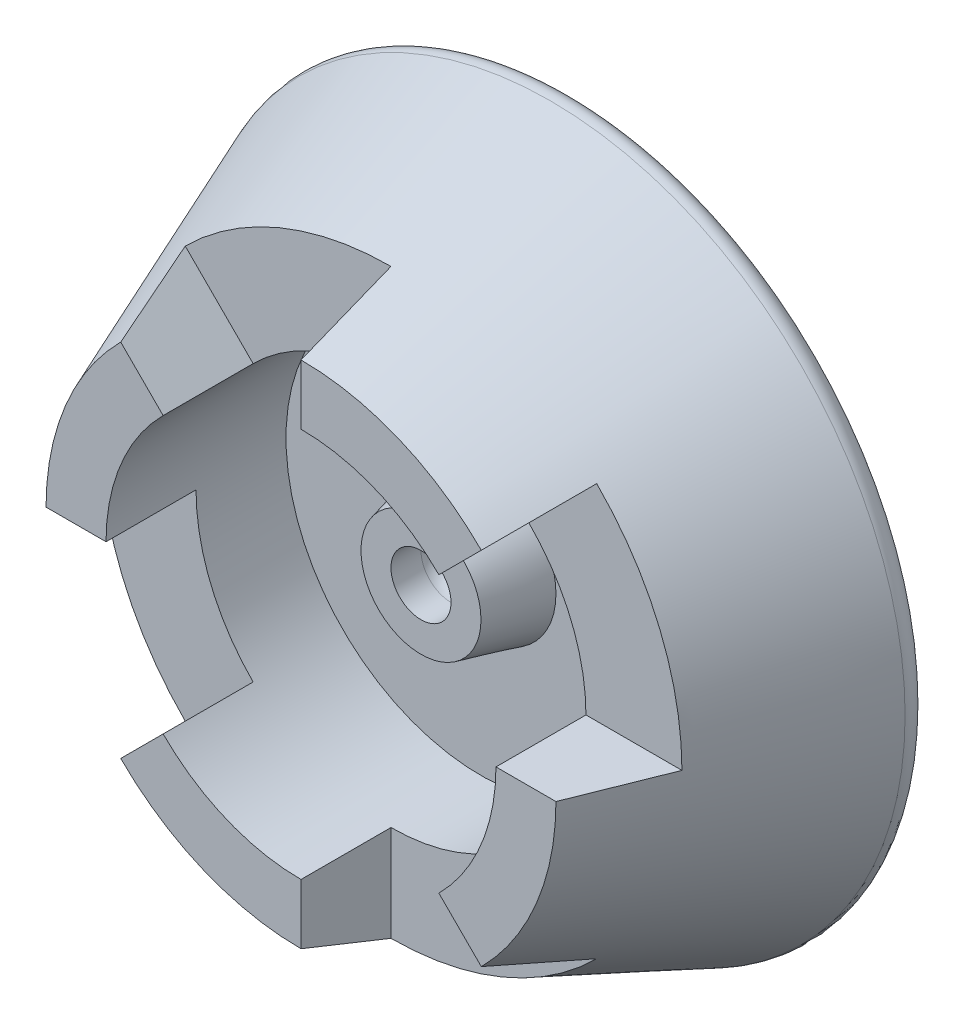
ISO-10303-21;
HEADER;
FILE_DESCRIPTION(('STEP AP214'),'2;1');
FILE_NAME('part.step','',(''),(''),'','','');
FILE_SCHEMA(('AUTOMOTIVE_DESIGN { 1 0 10303 214 1 1 1 1 }'));
ENDSEC;
DATA;
#1=APPLICATION_CONTEXT('core data for automotive mechanical design processes');
#2=APPLICATION_PROTOCOL_DEFINITION('international standard','automotive_design',2000,#1);
#3=PRODUCT_CONTEXT('',#1,'mechanical');
#4=PRODUCT('Part','Part','',(#3));
#5=PRODUCT_RELATED_PRODUCT_CATEGORY('part','',(#4));
#6=PRODUCT_DEFINITION_FORMATION('','',#4);
#7=PRODUCT_DEFINITION_CONTEXT('part definition',#1,'design');
#8=PRODUCT_DEFINITION('design','',#6,#7);
#9=PRODUCT_DEFINITION_SHAPE('','',#8);
#10=(LENGTH_UNIT() NAMED_UNIT(*) SI_UNIT(.MILLI.,.METRE.));
#11=(NAMED_UNIT(*) PLANE_ANGLE_UNIT() SI_UNIT($,.RADIAN.));
#12=(NAMED_UNIT(*) SI_UNIT($,.STERADIAN.) SOLID_ANGLE_UNIT());
#13=UNCERTAINTY_MEASURE_WITH_UNIT(LENGTH_MEASURE(1.E-05),#10,'distance_accuracy_value','');
#14=(GEOMETRIC_REPRESENTATION_CONTEXT(3) GLOBAL_UNCERTAINTY_ASSIGNED_CONTEXT((#13)) GLOBAL_UNIT_ASSIGNED_CONTEXT((#10,
#11,#12)) REPRESENTATION_CONTEXT('',''));
#15=CARTESIAN_POINT('',(0.,0.,0.));
#16=DIRECTION('',(0.,0.,1.));
#17=DIRECTION('',(1.,0.,0.));
#18=AXIS2_PLACEMENT_3D('',#15,#16,#17);
#19=CARTESIAN_POINT('',(0.,0.,17.145));
#20=DIRECTION('',(0.,0.,1.));
#21=DIRECTION('',(1.,0.,0.));
#22=AXIS2_PLACEMENT_3D('',#19,#20,#21);
#23=PLANE('',#22);
#24=CARTESIAN_POINT('',(0.,0.,17.145));
#25=DIRECTION('',(0.,0.,1.));
#26=DIRECTION('',(1.,0.,0.));
#27=AXIS2_PLACEMENT_3D('',#24,#25,#26);
#28=CIRCLE('',#27,8.255);
#29=CARTESIAN_POINT('',(5.83716647869495,-5.83716647869495,17.145));
#30=VERTEX_POINT('',#29);
#31=CARTESIAN_POINT('',(8.255,0.,17.145));
#32=VERTEX_POINT('',#31);
#33=EDGE_CURVE('E11',#30,#32,#28,.T.);
#34=ORIENTED_EDGE('',*,*,#33,.F.);
#35=DIRECTION('',(0.707106781186548,-0.707106781186548,0.));
#36=VECTOR('',#35,1.);
#37=CARTESIAN_POINT('',(4.88065532034932,-4.88065532034932,17.145));
#38=LINE('',#37,#36);
#39=CARTESIAN_POINT('',(7.63321770290878,-7.63321770290878,17.145));
#40=VERTEX_POINT('',#39);
#41=EDGE_CURVE('E26',#30,#40,#38,.T.);
#42=ORIENTED_EDGE('',*,*,#41,.T.);
#43=CARTESIAN_POINT('',(0.,0.,17.145));
#44=DIRECTION('',(0.,0.,1.));
#45=DIRECTION('',(1.,0.,0.));
#46=AXIS2_PLACEMENT_3D('',#43,#44,#45);
#47=CIRCLE('',#46,10.795);
#48=CARTESIAN_POINT('',(10.795,0.,17.145));
#49=VERTEX_POINT('',#48);
#50=EDGE_CURVE('E288',#40,#49,#47,.T.);
#51=ORIENTED_EDGE('',*,*,#50,.T.);
#52=DIRECTION('',(1.,0.,0.));
#53=VECTOR('',#52,1.);
#54=CARTESIAN_POINT('',(6.90228894730641,0.,17.145));
#55=LINE('',#54,#53);
#56=EDGE_CURVE('E285',#32,#49,#55,.T.);
#57=ORIENTED_EDGE('',*,*,#56,.F.);
#58=EDGE_LOOP('',(#34,#42,#51,#57));
#59=FACE_BOUND('',#58,.T.);
#60=ADVANCED_FACE('F17',(#59),#23,.T.);
#61=CARTESIAN_POINT('',(5.83716647869495,5.83716647869495,17.145));
#62=VERTEX_POINT('',#61);
#63=CARTESIAN_POINT('',(0.,8.255,17.145));
#64=VERTEX_POINT('',#63);
#65=EDGE_CURVE('E27',#62,#64,#28,.T.);
#66=ORIENTED_EDGE('',*,*,#65,.F.);
#67=DIRECTION('',(0.707106781186548,0.707106781186548,0.));
#68=VECTOR('',#67,1.);
#69=CARTESIAN_POINT('',(4.88065532034932,4.88065532034932,17.145));
#70=LINE('',#69,#68);
#71=CARTESIAN_POINT('',(7.63321770290878,7.63321770290878,17.145));
#72=VERTEX_POINT('',#71);
#73=EDGE_CURVE('E283',#62,#72,#70,.T.);
#74=ORIENTED_EDGE('',*,*,#73,.T.);
#75=CARTESIAN_POINT('',(0.,10.795,17.145));
#76=VERTEX_POINT('',#75);
#77=EDGE_CURVE('E282',#72,#76,#47,.T.);
#78=ORIENTED_EDGE('',*,*,#77,.T.);
#79=DIRECTION('',(0.,1.,0.));
#80=VECTOR('',#79,1.);
#81=CARTESIAN_POINT('',(0.,6.90228894730641,17.145));
#82=LINE('',#81,#80);
#83=EDGE_CURVE('E279',#64,#76,#82,.T.);
#84=ORIENTED_EDGE('',*,*,#83,.F.);
#85=EDGE_LOOP('',(#66,#74,#78,#84));
#86=FACE_BOUND('',#85,.T.);
#87=ADVANCED_FACE('F378',(#86),#23,.T.);
#88=CARTESIAN_POINT('',(-5.83716647869495,5.83716647869495,17.145));
#89=VERTEX_POINT('',#88);
#90=CARTESIAN_POINT('',(-8.255,0.,17.145));
#91=VERTEX_POINT('',#90);
#92=EDGE_CURVE('E278',#89,#91,#28,.T.);
#93=ORIENTED_EDGE('',*,*,#92,.F.);
#94=DIRECTION('',(-0.707106781186548,0.707106781186548,0.));
#95=VECTOR('',#94,1.);
#96=CARTESIAN_POINT('',(-4.88065532034932,4.88065532034932,17.145));
#97=LINE('',#96,#95);
#98=CARTESIAN_POINT('',(-7.63321770290878,7.63321770290878,17.145));
#99=VERTEX_POINT('',#98);
#100=EDGE_CURVE('E276',#89,#99,#97,.T.);
#101=ORIENTED_EDGE('',*,*,#100,.T.);
#102=CARTESIAN_POINT('',(-10.795,0.,17.145));
#103=VERTEX_POINT('',#102);
#104=EDGE_CURVE('E275',#99,#103,#47,.T.);
#105=ORIENTED_EDGE('',*,*,#104,.T.);
#106=DIRECTION('',(-1.,0.,0.));
#107=VECTOR('',#106,1.);
#108=CARTESIAN_POINT('',(-6.90228894730641,0.,17.145));
#109=LINE('',#108,#107);
#110=EDGE_CURVE('E272',#91,#103,#109,.T.);
#111=ORIENTED_EDGE('',*,*,#110,.F.);
#112=EDGE_LOOP('',(#93,#101,#105,#111));
#113=FACE_BOUND('',#112,.T.);
#114=ADVANCED_FACE('F296',(#113),#23,.T.);
#115=CARTESIAN_POINT('',(-5.83716647869495,-5.83716647869495,17.145));
#116=VERTEX_POINT('',#115);
#117=CARTESIAN_POINT('',(0.,-8.255,17.145));
#118=VERTEX_POINT('',#117);
#119=EDGE_CURVE('E21',#116,#118,#28,.T.);
#120=ORIENTED_EDGE('',*,*,#119,.F.);
#121=DIRECTION('',(-0.707106781186548,-0.707106781186548,0.));
#122=VECTOR('',#121,1.);
#123=CARTESIAN_POINT('',(-4.88065532034932,-4.88065532034932,17.145));
#124=LINE('',#123,#122);
#125=CARTESIAN_POINT('',(-7.63321770290878,-7.63321770290878,17.145));
#126=VERTEX_POINT('',#125);
#127=EDGE_CURVE('E270',#116,#126,#124,.T.);
#128=ORIENTED_EDGE('',*,*,#127,.T.);
#129=CARTESIAN_POINT('',(0.,-10.795,17.145));
#130=VERTEX_POINT('',#129);
#131=EDGE_CURVE('E269',#126,#130,#47,.T.);
#132=ORIENTED_EDGE('',*,*,#131,.T.);
#133=DIRECTION('',(0.,-1.,0.));
#134=VECTOR('',#133,1.);
#135=CARTESIAN_POINT('',(0.,-6.90228894730641,17.145));
#136=LINE('',#135,#134);
#137=EDGE_CURVE('E266',#118,#130,#136,.T.);
#138=ORIENTED_EDGE('',*,*,#137,.F.);
#139=EDGE_LOOP('',(#120,#128,#132,#138));
#140=FACE_BOUND('',#139,.T.);
#141=ADVANCED_FACE('F19',(#140),#23,.T.);
#142=CARTESIAN_POINT('',(0.,0.,17.145));
#143=DIRECTION('',(0.,0.,-1.));
#144=DIRECTION('',(-1.,0.,0.));
#145=AXIS2_PLACEMENT_3D('',#142,#143,#144);
#146=CONICAL_SURFACE('',#145,10.795,0.380506377112365);
#147=CARTESIAN_POINT('',(0.,0.,6.58583307948486));
#148=DIRECTION('',(0.,0.,-1.));
#149=DIRECTION('',(-1.,0.,0.));
#150=AXIS2_PLACEMENT_3D('',#147,#148,#149);
#151=CIRCLE('',#150,15.0186667682061);
#152=CARTESIAN_POINT('',(-15.0186667682061,0.,6.58583307948486));
#153=VERTEX_POINT('',#152);
#154=EDGE_CURVE('E263',#153,#153,#151,.F.);
#155=ORIENTED_EDGE('',*,*,#154,.T.);
#156=EDGE_LOOP('',(#155));
#157=FACE_BOUND('',#156,.T.);
#158=ORIENTED_EDGE('',*,*,#50,.F.);
#159=DIRECTION('',(-0.262612865719445,0.262612865719445,0.92847669088526));
#160=VECTOR('',#159,1.);
#161=CARTESIAN_POINT('',(0.,0.,44.1325));
#162=LINE('',#161,#160);
#163=CARTESIAN_POINT('',(8.71084843743708,-8.71084843743708,13.335));
#164=VERTEX_POINT('',#163);
#165=EDGE_CURVE('E261',#40,#164,#162,.F.);
#166=ORIENTED_EDGE('',*,*,#165,.T.);
#167=CARTESIAN_POINT('',(0.,0.,13.335));
#168=DIRECTION('',(0.,0.,1.));
#169=DIRECTION('',(1.,0.,0.));
#170=AXIS2_PLACEMENT_3D('',#167,#168,#169);
#171=CIRCLE('',#170,12.319);
#172=CARTESIAN_POINT('',(0.,-12.319,13.335));
#173=VERTEX_POINT('',#172);
#174=EDGE_CURVE('E170',#164,#173,#171,.F.);
#175=ORIENTED_EDGE('',*,*,#174,.T.);
#176=DIRECTION('',(0.,0.371390676354104,0.928476690885259));
#177=VECTOR('',#176,1.);
#178=CARTESIAN_POINT('',(0.,0.,44.1325));
#179=LINE('',#178,#177);
#180=EDGE_CURVE('E257',#130,#173,#179,.F.);
#181=ORIENTED_EDGE('',*,*,#180,.F.);
#182=ORIENTED_EDGE('',*,*,#131,.F.);
#183=DIRECTION('',(0.262612865719446,0.262612865719445,0.928476690885259));
#184=VECTOR('',#183,1.);
#185=CARTESIAN_POINT('',(0.,0.,44.1325));
#186=LINE('',#185,#184);
#187=CARTESIAN_POINT('',(-8.71084843743708,-8.71084843743708,13.335));
#188=VERTEX_POINT('',#187);
#189=EDGE_CURVE('E255',#126,#188,#186,.F.);
#190=ORIENTED_EDGE('',*,*,#189,.T.);
#191=CARTESIAN_POINT('',(-12.319,0.,13.335));
#192=VERTEX_POINT('',#191);
#193=EDGE_CURVE('E254',#188,#192,#171,.F.);
#194=ORIENTED_EDGE('',*,*,#193,.T.);
#195=DIRECTION('',(0.371390676354104,0.,0.928476690885259));
#196=VECTOR('',#195,1.);
#197=CARTESIAN_POINT('',(0.,0.,44.1325));
#198=LINE('',#197,#196);
#199=EDGE_CURVE('E251',#103,#192,#198,.F.);
#200=ORIENTED_EDGE('',*,*,#199,.F.);
#201=ORIENTED_EDGE('',*,*,#104,.F.);
#202=DIRECTION('',(0.262612865719445,-0.262612865719446,0.928476690885259));
#203=VECTOR('',#202,1.);
#204=CARTESIAN_POINT('',(0.,0.,44.1325));
#205=LINE('',#204,#203);
#206=CARTESIAN_POINT('',(-8.71084843743708,8.71084843743708,13.335));
#207=VERTEX_POINT('',#206);
#208=EDGE_CURVE('E249',#99,#207,#205,.F.);
#209=ORIENTED_EDGE('',*,*,#208,.T.);
#210=CARTESIAN_POINT('',(0.,12.319,13.335));
#211=VERTEX_POINT('',#210);
#212=EDGE_CURVE('E248',#207,#211,#171,.F.);
#213=ORIENTED_EDGE('',*,*,#212,.T.);
#214=DIRECTION('',(0.,-0.371390676354104,0.928476690885259));
#215=VECTOR('',#214,1.);
#216=CARTESIAN_POINT('',(0.,0.,44.1325));
#217=LINE('',#216,#215);
#218=EDGE_CURVE('E245',#76,#211,#217,.F.);
#219=ORIENTED_EDGE('',*,*,#218,.F.);
#220=ORIENTED_EDGE('',*,*,#77,.F.);
#221=DIRECTION('',(-0.262612865719445,-0.262612865719445,0.92847669088526));
#222=VECTOR('',#221,1.);
#223=CARTESIAN_POINT('',(0.,0.,44.1325));
#224=LINE('',#223,#222);
#225=CARTESIAN_POINT('',(8.71084843743708,8.71084843743708,13.335));
#226=VERTEX_POINT('',#225);
#227=EDGE_CURVE('E243',#72,#226,#224,.F.);
#228=ORIENTED_EDGE('',*,*,#227,.T.);
#229=CARTESIAN_POINT('',(12.319,0.,13.335));
#230=VERTEX_POINT('',#229);
#231=EDGE_CURVE('E242',#226,#230,#171,.F.);
#232=ORIENTED_EDGE('',*,*,#231,.T.);
#233=DIRECTION('',(-0.371390676354104,0.,0.928476690885259));
#234=VECTOR('',#233,1.);
#235=CARTESIAN_POINT('',(0.,0.,44.1325));
#236=LINE('',#235,#234);
#237=EDGE_CURVE('E239',#49,#230,#236,.F.);
#238=ORIENTED_EDGE('',*,*,#237,.F.);
#239=EDGE_LOOP('',(#158,#166,#175,#181,#182,#190,#194,#200,#201,#209,#213,#219,#220,#228,#232,#238));
#240=FACE_BOUND('',#239,.T.);
#241=ADVANCED_FACE('F301',(#157,#240),#146,.T.);
#242=CARTESIAN_POINT('',(0.,3.048,5.715));
#243=DIRECTION('',(0.,1.,0.));
#244=DIRECTION('',(0.,0.,1.));
#245=AXIS2_PLACEMENT_3D('',#242,#243,#244);
#246=PLANE('',#245);
#247=DIRECTION('',(1.,0.,0.));
#248=VECTOR('',#247,1.);
#249=CARTESIAN_POINT('',(0.,3.048,0.));
#250=LINE('',#249,#248);
#251=CARTESIAN_POINT('',(-3.048,3.048,0.));
#252=VERTEX_POINT('',#251);
#253=CARTESIAN_POINT('',(3.048,3.048,0.));
#254=VERTEX_POINT('',#253);
#255=EDGE_CURVE('E236',#252,#254,#250,.T.);
#256=ORIENTED_EDGE('',*,*,#255,.F.);
#257=DIRECTION('',(0.,0.,-1.));
#258=VECTOR('',#257,1.);
#259=CARTESIAN_POINT('',(-3.048,3.048,5.715));
#260=LINE('',#259,#258);
#261=CARTESIAN_POINT('',(-3.048,3.048,5.715));
#262=VERTEX_POINT('',#261);
#263=EDGE_CURVE('E233',#262,#252,#260,.T.);
#264=ORIENTED_EDGE('',*,*,#263,.F.);
#265=DIRECTION('',(1.,0.,0.));
#266=VECTOR('',#265,1.);
#267=CARTESIAN_POINT('',(0.,3.048,5.715));
#268=LINE('',#267,#266);
#269=CARTESIAN_POINT('',(3.048,3.048,5.715));
#270=VERTEX_POINT('',#269);
#271=EDGE_CURVE('E231',#262,#270,#268,.T.);
#272=ORIENTED_EDGE('',*,*,#271,.T.);
#273=DIRECTION('',(0.,0.,-1.));
#274=VECTOR('',#273,1.);
#275=CARTESIAN_POINT('',(3.048,3.048,5.715));
#276=LINE('',#275,#274);
#277=EDGE_CURVE('E229',#270,#254,#276,.T.);
#278=ORIENTED_EDGE('',*,*,#277,.T.);
#279=EDGE_LOOP('',(#256,#264,#272,#278));
#280=FACE_BOUND('',#279,.T.);
#281=ADVANCED_FACE('F392',(#280),#246,.T.);
#282=CARTESIAN_POINT('',(-3.048,0.,5.715));
#283=DIRECTION('',(1.,0.,0.));
#284=DIRECTION('',(0.,1.,0.));
#285=AXIS2_PLACEMENT_3D('',#282,#283,#284);
#286=PLANE('',#285);
#287=DIRECTION('',(0.,-1.,0.));
#288=VECTOR('',#287,1.);
#289=CARTESIAN_POINT('',(-3.048,0.,0.));
#290=LINE('',#289,#288);
#291=CARTESIAN_POINT('',(-3.048,-3.048,0.));
#292=VERTEX_POINT('',#291);
#293=EDGE_CURVE('E227',#252,#292,#290,.T.);
#294=ORIENTED_EDGE('',*,*,#293,.T.);
#295=DIRECTION('',(0.,0.,-1.));
#296=VECTOR('',#295,1.);
#297=CARTESIAN_POINT('',(-3.048,-3.048,5.715));
#298=LINE('',#297,#296);
#299=CARTESIAN_POINT('',(-3.048,-3.048,5.715));
#300=VERTEX_POINT('',#299);
#301=EDGE_CURVE('E224',#300,#292,#298,.T.);
#302=ORIENTED_EDGE('',*,*,#301,.F.);
#303=DIRECTION('',(0.,-1.,0.));
#304=VECTOR('',#303,1.);
#305=CARTESIAN_POINT('',(-3.048,0.,5.715));
#306=LINE('',#305,#304);
#307=EDGE_CURVE('E221',#262,#300,#306,.T.);
#308=ORIENTED_EDGE('',*,*,#307,.F.);
#309=ORIENTED_EDGE('',*,*,#263,.T.);
#310=EDGE_LOOP('',(#294,#302,#308,#309));
#311=FACE_BOUND('',#310,.T.);
#312=ADVANCED_FACE('F433',(#311),#286,.F.);
#313=CARTESIAN_POINT('',(0.,-3.048,5.715));
#314=DIRECTION('',(0.,1.,0.));
#315=DIRECTION('',(0.,0.,1.));
#316=AXIS2_PLACEMENT_3D('',#313,#314,#315);
#317=PLANE('',#316);
#318=DIRECTION('',(1.,0.,0.));
#319=VECTOR('',#318,1.);
#320=CARTESIAN_POINT('',(0.,-3.048,0.));
#321=LINE('',#320,#319);
#322=CARTESIAN_POINT('',(3.048,-3.048,0.));
#323=VERTEX_POINT('',#322);
#324=EDGE_CURVE('E219',#292,#323,#321,.T.);
#325=ORIENTED_EDGE('',*,*,#324,.T.);
#326=DIRECTION('',(0.,0.,-1.));
#327=VECTOR('',#326,1.);
#328=CARTESIAN_POINT('',(3.048,-3.048,5.715));
#329=LINE('',#328,#327);
#330=CARTESIAN_POINT('',(3.048,-3.048,5.715));
#331=VERTEX_POINT('',#330);
#332=EDGE_CURVE('E216',#331,#323,#329,.T.);
#333=ORIENTED_EDGE('',*,*,#332,.F.);
#334=DIRECTION('',(1.,0.,0.));
#335=VECTOR('',#334,1.);
#336=CARTESIAN_POINT('',(0.,-3.048,5.715));
#337=LINE('',#336,#335);
#338=EDGE_CURVE('E213',#300,#331,#337,.T.);
#339=ORIENTED_EDGE('',*,*,#338,.F.);
#340=ORIENTED_EDGE('',*,*,#301,.T.);
#341=EDGE_LOOP('',(#325,#333,#339,#340));
#342=FACE_BOUND('',#341,.T.);
#343=ADVANCED_FACE('F442',(#342),#317,.F.);
#344=CARTESIAN_POINT('',(3.048,0.,5.715));
#345=DIRECTION('',(1.,0.,0.));
#346=DIRECTION('',(0.,1.,0.));
#347=AXIS2_PLACEMENT_3D('',#344,#345,#346);
#348=PLANE('',#347);
#349=DIRECTION('',(0.,-1.,0.));
#350=VECTOR('',#349,1.);
#351=CARTESIAN_POINT('',(3.048,0.,0.));
#352=LINE('',#351,#350);
#353=EDGE_CURVE('E210',#254,#323,#352,.T.);
#354=ORIENTED_EDGE('',*,*,#353,.F.);
#355=ORIENTED_EDGE('',*,*,#277,.F.);
#356=DIRECTION('',(0.,-1.,0.));
#357=VECTOR('',#356,1.);
#358=CARTESIAN_POINT('',(3.048,0.,5.715));
#359=LINE('',#358,#357);
#360=EDGE_CURVE('E207',#270,#331,#359,.T.);
#361=ORIENTED_EDGE('',*,*,#360,.T.);
#362=ORIENTED_EDGE('',*,*,#332,.T.);
#363=EDGE_LOOP('',(#354,#355,#361,#362));
#364=FACE_BOUND('',#363,.T.);
#365=ADVANCED_FACE('F451',(#364),#348,.T.);
#366=CARTESIAN_POINT('',(0.,0.,0.));
#367=DIRECTION('',(0.,0.,1.));
#368=DIRECTION('',(1.,0.,0.));
#369=AXIS2_PLACEMENT_3D('',#366,#367,#368);
#370=PLANE('',#369);
#371=ORIENTED_EDGE('',*,*,#255,.T.);
#372=ORIENTED_EDGE('',*,*,#353,.T.);
#373=ORIENTED_EDGE('',*,*,#324,.F.);
#374=ORIENTED_EDGE('',*,*,#293,.F.);
#375=EDGE_LOOP('',(#371,#372,#373,#374));
#376=FACE_BOUND('',#375,.T.);
#377=ADVANCED_FACE('F460',(#376),#370,.F.);
#378=CARTESIAN_POINT('',(0.,0.,5.715));
#379=DIRECTION('',(0.,0.,1.));
#380=DIRECTION('',(1.,0.,0.));
#381=AXIS2_PLACEMENT_3D('',#378,#379,#380);
#382=PLANE('',#381);
#383=CARTESIAN_POINT('',(0.,0.,5.715));
#384=DIRECTION('',(0.,0.,1.));
#385=DIRECTION('',(1.,0.,0.));
#386=AXIS2_PLACEMENT_3D('',#383,#384,#385);
#387=CIRCLE('',#386,14.4290840694939);
#388=CARTESIAN_POINT('',(14.4290840694939,0.,5.715));
#389=VERTEX_POINT('',#388);
#390=EDGE_CURVE('E204',#389,#389,#387,.F.);
#391=ORIENTED_EDGE('',*,*,#390,.T.);
#392=EDGE_LOOP('',(#391));
#393=FACE_BOUND('',#392,.T.);
#394=ORIENTED_EDGE('',*,*,#271,.F.);
#395=ORIENTED_EDGE('',*,*,#307,.T.);
#396=ORIENTED_EDGE('',*,*,#338,.T.);
#397=ORIENTED_EDGE('',*,*,#360,.F.);
#398=EDGE_LOOP('',(#394,#395,#396,#397));
#399=FACE_BOUND('',#398,.T.);
#400=ADVANCED_FACE('F469',(#393,#399),#382,.F.);
#401=CARTESIAN_POINT('',(0.,0.,9.525));
#402=DIRECTION('',(0.,0.,1.));
#403=DIRECTION('',(1.,0.,0.));
#404=AXIS2_PLACEMENT_3D('',#401,#402,#403);
#405=CYLINDRICAL_SURFACE('',#404,8.255);
#406=DIRECTION('',(0.,0.,1.));
#407=VECTOR('',#406,1.);
#408=CARTESIAN_POINT('',(8.255,0.,13.335));
#409=LINE('',#408,#407);
#410=CARTESIAN_POINT('',(8.255,0.,13.335));
#411=VERTEX_POINT('',#410);
#412=EDGE_CURVE('E201',#411,#32,#409,.T.);
#413=ORIENTED_EDGE('',*,*,#412,.F.);
#414=CARTESIAN_POINT('',(0.,0.,13.335));
#415=DIRECTION('',(0.,0.,1.));
#416=DIRECTION('',(1.,0.,0.));
#417=AXIS2_PLACEMENT_3D('',#414,#415,#416);
#418=CIRCLE('',#417,8.255);
#419=CARTESIAN_POINT('',(5.83716647869495,5.83716647869495,13.335));
#420=VERTEX_POINT('',#419);
#421=EDGE_CURVE('E164',#420,#411,#418,.F.);
#422=ORIENTED_EDGE('',*,*,#421,.F.);
#423=DIRECTION('',(0.,0.,1.));
#424=VECTOR('',#423,1.);
#425=CARTESIAN_POINT('',(5.83716647869495,5.83716647869495,13.335));
#426=LINE('',#425,#424);
#427=EDGE_CURVE('E198',#420,#62,#426,.T.);
#428=ORIENTED_EDGE('',*,*,#427,.T.);
#429=ORIENTED_EDGE('',*,*,#65,.T.);
#430=DIRECTION('',(0.,0.,1.));
#431=VECTOR('',#430,1.);
#432=CARTESIAN_POINT('',(0.,8.255,13.335));
#433=LINE('',#432,#431);
#434=CARTESIAN_POINT('',(0.,8.255,13.335));
#435=VERTEX_POINT('',#434);
#436=EDGE_CURVE('E195',#435,#64,#433,.T.);
#437=ORIENTED_EDGE('',*,*,#436,.F.);
#438=CARTESIAN_POINT('',(-5.83716647869495,5.83716647869495,13.335));
#439=VERTEX_POINT('',#438);
#440=EDGE_CURVE('E194',#439,#435,#418,.F.);
#441=ORIENTED_EDGE('',*,*,#440,.F.);
#442=DIRECTION('',(0.,0.,1.));
#443=VECTOR('',#442,1.);
#444=CARTESIAN_POINT('',(-5.83716647869495,5.83716647869495,13.335));
#445=LINE('',#444,#443);
#446=EDGE_CURVE('E191',#439,#89,#445,.T.);
#447=ORIENTED_EDGE('',*,*,#446,.T.);
#448=ORIENTED_EDGE('',*,*,#92,.T.);
#449=DIRECTION('',(0.,0.,1.));
#450=VECTOR('',#449,1.);
#451=CARTESIAN_POINT('',(-8.255,0.,13.335));
#452=LINE('',#451,#450);
#453=CARTESIAN_POINT('',(-8.255,0.,13.335));
#454=VERTEX_POINT('',#453);
#455=EDGE_CURVE('E188',#454,#91,#452,.T.);
#456=ORIENTED_EDGE('',*,*,#455,.F.);
#457=CARTESIAN_POINT('',(-5.83716647869495,-5.83716647869495,13.335));
#458=VERTEX_POINT('',#457);
#459=EDGE_CURVE('E165',#458,#454,#418,.F.);
#460=ORIENTED_EDGE('',*,*,#459,.F.);
#461=DIRECTION('',(0.,0.,1.));
#462=VECTOR('',#461,1.);
#463=CARTESIAN_POINT('',(-5.83716647869495,-5.83716647869495,13.335));
#464=LINE('',#463,#462);
#465=EDGE_CURVE('E185',#458,#116,#464,.T.);
#466=ORIENTED_EDGE('',*,*,#465,.T.);
#467=ORIENTED_EDGE('',*,*,#119,.T.);
#468=DIRECTION('',(0.,0.,1.));
#469=VECTOR('',#468,1.);
#470=CARTESIAN_POINT('',(0.,-8.255,13.335));
#471=LINE('',#470,#469);
#472=CARTESIAN_POINT('',(0.,-8.255,13.335));
#473=VERTEX_POINT('',#472);
#474=EDGE_CURVE('E159',#473,#118,#471,.T.);
#475=ORIENTED_EDGE('',*,*,#474,.F.);
#476=CARTESIAN_POINT('',(5.83716647869495,-5.83716647869495,13.335));
#477=VERTEX_POINT('',#476);
#478=EDGE_CURVE('E151',#477,#473,#418,.F.);
#479=ORIENTED_EDGE('',*,*,#478,.F.);
#480=DIRECTION('',(0.,0.,1.));
#481=VECTOR('',#480,1.);
#482=CARTESIAN_POINT('',(5.83716647869495,-5.83716647869495,13.335));
#483=LINE('',#482,#481);
#484=EDGE_CURVE('E156',#477,#30,#483,.T.);
#485=ORIENTED_EDGE('',*,*,#484,.T.);
#486=ORIENTED_EDGE('',*,*,#33,.T.);
#487=EDGE_LOOP('',(#413,#422,#428,#429,#437,#441,#447,#448,#456,#460,#466,#467,#475,#479,#485,#486));
#488=FACE_BOUND('',#487,.T.);
#489=CARTESIAN_POINT('',(0.,0.,9.525));
#490=DIRECTION('',(0.,0.,1.));
#491=DIRECTION('',(1.,0.,0.));
#492=AXIS2_PLACEMENT_3D('',#489,#490,#491);
#493=CIRCLE('',#492,8.255);
#494=CARTESIAN_POINT('',(8.255,0.,9.525));
#495=VERTEX_POINT('',#494);
#496=EDGE_CURVE('E177',#495,#495,#493,.T.);
#497=ORIENTED_EDGE('',*,*,#496,.F.);
#498=EDGE_LOOP('',(#497));
#499=FACE_BOUND('',#498,.T.);
#500=ADVANCED_FACE('F153',(#488,#499),#405,.F.);
#501=CARTESIAN_POINT('',(0.,0.,9.525));
#502=DIRECTION('',(0.,0.,1.));
#503=DIRECTION('',(1.,0.,0.));
#504=AXIS2_PLACEMENT_3D('',#501,#502,#503);
#505=PLANE('',#504);
#506=CARTESIAN_POINT('',(0.,0.,9.525));
#507=DIRECTION('',(0.,0.,1.));
#508=DIRECTION('',(1.,0.,0.));
#509=AXIS2_PLACEMENT_3D('',#506,#507,#508);
#510=CIRCLE('',#509,3.175);
#511=CARTESIAN_POINT('',(3.175,0.,9.525));
#512=VERTEX_POINT('',#511);
#513=EDGE_CURVE('E180',#512,#512,#510,.F.);
#514=ORIENTED_EDGE('',*,*,#513,.T.);
#515=EDGE_LOOP('',(#514));
#516=FACE_BOUND('',#515,.T.);
#517=ORIENTED_EDGE('',*,*,#496,.T.);
#518=EDGE_LOOP('',(#517));
#519=FACE_BOUND('',#518,.T.);
#520=ADVANCED_FACE('F342',(#516,#519),#505,.T.);
#521=CARTESIAN_POINT('',(0.,0.,13.335));
#522=DIRECTION('',(0.,0.,1.));
#523=DIRECTION('',(1.,0.,0.));
#524=AXIS2_PLACEMENT_3D('',#521,#522,#523);
#525=PLANE('',#524);
#526=DIRECTION('',(0.707106781186548,0.707106781186548,0.));
#527=VECTOR('',#526,1.);
#528=CARTESIAN_POINT('',(4.88065532034932,4.88065532034932,13.335));
#529=LINE('',#528,#527);
#530=EDGE_CURVE('E328',#420,#226,#529,.T.);
#531=ORIENTED_EDGE('',*,*,#530,.F.);
#532=ORIENTED_EDGE('',*,*,#421,.T.);
#533=DIRECTION('',(1.,0.,0.));
#534=VECTOR('',#533,1.);
#535=CARTESIAN_POINT('',(6.90228894730641,0.,13.335));
#536=LINE('',#535,#534);
#537=EDGE_CURVE('E326',#411,#230,#536,.T.);
#538=ORIENTED_EDGE('',*,*,#537,.T.);
#539=ORIENTED_EDGE('',*,*,#231,.F.);
#540=EDGE_LOOP('',(#531,#532,#538,#539));
#541=FACE_BOUND('',#540,.T.);
#542=ADVANCED_FACE('F324',(#541),#525,.T.);
#543=CARTESIAN_POINT('',(4.88065532034932,4.88065532034932,13.335));
#544=DIRECTION('',(0.707106781186548,-0.707106781186548,0.));
#545=DIRECTION('',(0.707106781186548,0.707106781186548,0.));
#546=AXIS2_PLACEMENT_3D('',#543,#544,#545);
#547=PLANE('',#546);
#548=ORIENTED_EDGE('',*,*,#73,.F.);
#549=ORIENTED_EDGE('',*,*,#427,.F.);
#550=ORIENTED_EDGE('',*,*,#530,.T.);
#551=ORIENTED_EDGE('',*,*,#227,.F.);
#552=EDGE_LOOP('',(#548,#549,#550,#551));
#553=FACE_BOUND('',#552,.T.);
#554=ADVANCED_FACE('F380',(#553),#547,.T.);
#555=CARTESIAN_POINT('',(6.90228894730641,0.,13.335));
#556=DIRECTION('',(0.,-1.,0.));
#557=DIRECTION('',(1.,0.,0.));
#558=AXIS2_PLACEMENT_3D('',#555,#556,#557);
#559=PLANE('',#558);
#560=ORIENTED_EDGE('',*,*,#237,.T.);
#561=ORIENTED_EDGE('',*,*,#537,.F.);
#562=ORIENTED_EDGE('',*,*,#412,.T.);
#563=ORIENTED_EDGE('',*,*,#56,.T.);
#564=EDGE_LOOP('',(#560,#561,#562,#563));
#565=FACE_BOUND('',#564,.T.);
#566=ADVANCED_FACE('F331',(#565),#559,.F.);
#567=DIRECTION('',(-0.707106781186548,0.707106781186548,0.));
#568=VECTOR('',#567,1.);
#569=CARTESIAN_POINT('',(-4.88065532034932,4.88065532034932,13.335));
#570=LINE('',#569,#568);
#571=EDGE_CURVE('E332',#439,#207,#570,.T.);
#572=ORIENTED_EDGE('',*,*,#571,.F.);
#573=ORIENTED_EDGE('',*,*,#440,.T.);
#574=DIRECTION('',(0.,1.,0.));
#575=VECTOR('',#574,1.);
#576=CARTESIAN_POINT('',(0.,6.90228894730641,13.335));
#577=LINE('',#576,#575);
#578=EDGE_CURVE('E336',#435,#211,#577,.T.);
#579=ORIENTED_EDGE('',*,*,#578,.T.);
#580=ORIENTED_EDGE('',*,*,#212,.F.);
#581=EDGE_LOOP('',(#572,#573,#579,#580));
#582=FACE_BOUND('',#581,.T.);
#583=ADVANCED_FACE('F366',(#582),#525,.T.);
#584=CARTESIAN_POINT('',(-4.88065532034932,4.88065532034932,13.335));
#585=DIRECTION('',(0.707106781186548,0.707106781186548,0.));
#586=DIRECTION('',(-0.707106781186548,0.707106781186548,0.));
#587=AXIS2_PLACEMENT_3D('',#584,#585,#586);
#588=PLANE('',#587);
#589=ORIENTED_EDGE('',*,*,#100,.F.);
#590=ORIENTED_EDGE('',*,*,#446,.F.);
#591=ORIENTED_EDGE('',*,*,#571,.T.);
#592=ORIENTED_EDGE('',*,*,#208,.F.);
#593=EDGE_LOOP('',(#589,#590,#591,#592));
#594=FACE_BOUND('',#593,.T.);
#595=ADVANCED_FACE('F521',(#594),#588,.T.);
#596=CARTESIAN_POINT('',(0.,6.90228894730641,13.335));
#597=DIRECTION('',(1.,0.,0.));
#598=DIRECTION('',(0.,1.,0.));
#599=AXIS2_PLACEMENT_3D('',#596,#597,#598);
#600=PLANE('',#599);
#601=ORIENTED_EDGE('',*,*,#218,.T.);
#602=ORIENTED_EDGE('',*,*,#578,.F.);
#603=ORIENTED_EDGE('',*,*,#436,.T.);
#604=ORIENTED_EDGE('',*,*,#83,.T.);
#605=EDGE_LOOP('',(#601,#602,#603,#604));
#606=FACE_BOUND('',#605,.T.);
#607=ADVANCED_FACE('F368',(#606),#600,.F.);
#608=DIRECTION('',(-0.707106781186548,-0.707106781186548,0.));
#609=VECTOR('',#608,1.);
#610=CARTESIAN_POINT('',(-4.88065532034932,-4.88065532034932,13.335));
#611=LINE('',#610,#609);
#612=EDGE_CURVE('E312',#458,#188,#611,.T.);
#613=ORIENTED_EDGE('',*,*,#612,.F.);
#614=ORIENTED_EDGE('',*,*,#459,.T.);
#615=DIRECTION('',(-1.,0.,0.));
#616=VECTOR('',#615,1.);
#617=CARTESIAN_POINT('',(-6.90228894730641,0.,13.335));
#618=LINE('',#617,#616);
#619=EDGE_CURVE('E173',#454,#192,#618,.T.);
#620=ORIENTED_EDGE('',*,*,#619,.T.);
#621=ORIENTED_EDGE('',*,*,#193,.F.);
#622=EDGE_LOOP('',(#613,#614,#620,#621));
#623=FACE_BOUND('',#622,.T.);
#624=ADVANCED_FACE('F310',(#623),#525,.T.);
#625=CARTESIAN_POINT('',(-4.88065532034932,-4.88065532034932,13.335));
#626=DIRECTION('',(-0.707106781186547,0.707106781186548,0.));
#627=DIRECTION('',(-0.707106781186548,-0.707106781186547,0.));
#628=AXIS2_PLACEMENT_3D('',#625,#626,#627);
#629=PLANE('',#628);
#630=ORIENTED_EDGE('',*,*,#127,.F.);
#631=ORIENTED_EDGE('',*,*,#465,.F.);
#632=ORIENTED_EDGE('',*,*,#612,.T.);
#633=ORIENTED_EDGE('',*,*,#189,.F.);
#634=EDGE_LOOP('',(#630,#631,#632,#633));
#635=FACE_BOUND('',#634,.T.);
#636=ADVANCED_FACE('F543',(#635),#629,.T.);
#637=CARTESIAN_POINT('',(-6.90228894730641,0.,13.335));
#638=DIRECTION('',(0.,1.,0.));
#639=DIRECTION('',(-1.,0.,0.));
#640=AXIS2_PLACEMENT_3D('',#637,#638,#639);
#641=PLANE('',#640);
#642=ORIENTED_EDGE('',*,*,#199,.T.);
#643=ORIENTED_EDGE('',*,*,#619,.F.);
#644=ORIENTED_EDGE('',*,*,#455,.T.);
#645=ORIENTED_EDGE('',*,*,#110,.T.);
#646=EDGE_LOOP('',(#642,#643,#644,#645));
#647=FACE_BOUND('',#646,.T.);
#648=ADVANCED_FACE('F306',(#647),#641,.F.);
#649=DIRECTION('',(0.707106781186548,-0.707106781186548,0.));
#650=VECTOR('',#649,1.);
#651=CARTESIAN_POINT('',(4.88065532034932,-4.88065532034932,13.335));
#652=LINE('',#651,#650);
#653=EDGE_CURVE('E168',#477,#164,#652,.T.);
#654=ORIENTED_EDGE('',*,*,#653,.F.);
#655=ORIENTED_EDGE('',*,*,#478,.T.);
#656=DIRECTION('',(0.,-1.,0.));
#657=VECTOR('',#656,1.);
#658=CARTESIAN_POINT('',(0.,-6.90228894730641,13.335));
#659=LINE('',#658,#657);
#660=EDGE_CURVE('E174',#473,#173,#659,.T.);
#661=ORIENTED_EDGE('',*,*,#660,.T.);
#662=ORIENTED_EDGE('',*,*,#174,.F.);
#663=EDGE_LOOP('',(#654,#655,#661,#662));
#664=FACE_BOUND('',#663,.T.);
#665=ADVANCED_FACE('F169',(#664),#525,.T.);
#666=CARTESIAN_POINT('',(4.88065532034932,-4.88065532034932,13.335));
#667=DIRECTION('',(-0.707106781186548,-0.707106781186548,0.));
#668=DIRECTION('',(0.707106781186548,-0.707106781186548,0.));
#669=AXIS2_PLACEMENT_3D('',#666,#667,#668);
#670=PLANE('',#669);
#671=ORIENTED_EDGE('',*,*,#41,.F.);
#672=ORIENTED_EDGE('',*,*,#484,.F.);
#673=ORIENTED_EDGE('',*,*,#653,.T.);
#674=ORIENTED_EDGE('',*,*,#165,.F.);
#675=EDGE_LOOP('',(#671,#672,#673,#674));
#676=FACE_BOUND('',#675,.T.);
#677=ADVANCED_FACE('F176',(#676),#670,.T.);
#678=CARTESIAN_POINT('',(0.,-6.90228894730641,13.335));
#679=DIRECTION('',(-1.,0.,0.));
#680=DIRECTION('',(0.,0.,1.));
#681=AXIS2_PLACEMENT_3D('',#678,#679,#680);
#682=PLANE('',#681);
#683=ORIENTED_EDGE('',*,*,#180,.T.);
#684=ORIENTED_EDGE('',*,*,#660,.F.);
#685=ORIENTED_EDGE('',*,*,#474,.T.);
#686=ORIENTED_EDGE('',*,*,#137,.T.);
#687=EDGE_LOOP('',(#683,#684,#685,#686));
#688=FACE_BOUND('',#687,.T.);
#689=ADVANCED_FACE('F373',(#688),#682,.F.);
#690=CARTESIAN_POINT('',(0.,0.,12.065));
#691=DIRECTION('',(0.,0.,-1.));
#692=DIRECTION('',(-1.,0.,0.));
#693=AXIS2_PLACEMENT_3D('',#690,#691,#692);
#694=CYLINDRICAL_SURFACE('',#693,1.27);
#695=CARTESIAN_POINT('',(0.,0.,10.795));
#696=DIRECTION('',(0.,0.,-1.));
#697=DIRECTION('',(-1.,0.,0.));
#698=AXIS2_PLACEMENT_3D('',#695,#696,#697);
#699=CIRCLE('',#698,1.27);
#700=CARTESIAN_POINT('',(-1.27,0.,10.795));
#701=VERTEX_POINT('',#700);
#702=EDGE_CURVE('E358',#701,#701,#699,.T.);
#703=ORIENTED_EDGE('',*,*,#702,.T.);
#704=EDGE_LOOP('',(#703));
#705=FACE_BOUND('',#704,.T.);
#706=CARTESIAN_POINT('',(0.,0.,12.065));
#707=DIRECTION('',(0.,0.,1.));
#708=DIRECTION('',(1.,0.,0.));
#709=AXIS2_PLACEMENT_3D('',#706,#707,#708);
#710=CIRCLE('',#709,1.27);
#711=CARTESIAN_POINT('',(1.27,0.,12.065));
#712=VERTEX_POINT('',#711);
#713=EDGE_CURVE('E355',#712,#712,#710,.T.);
#714=ORIENTED_EDGE('',*,*,#713,.T.);
#715=EDGE_LOOP('',(#714));
#716=FACE_BOUND('',#715,.T.);
#717=ADVANCED_FACE('F578',(#705,#716),#694,.F.);
#718=CARTESIAN_POINT('',(0.,0.,12.065));
#719=DIRECTION('',(0.,0.,1.));
#720=DIRECTION('',(1.,0.,0.));
#721=AXIS2_PLACEMENT_3D('',#718,#719,#720);
#722=PLANE('',#721);
#723=ORIENTED_EDGE('',*,*,#713,.F.);
#724=EDGE_LOOP('',(#723));
#725=FACE_BOUND('',#724,.T.);
#726=CARTESIAN_POINT('',(0.,0.,12.065));
#727=DIRECTION('',(0.,0.,1.));
#728=DIRECTION('',(1.,0.,0.));
#729=AXIS2_PLACEMENT_3D('',#726,#727,#728);
#730=CIRCLE('',#729,2.54);
#731=CARTESIAN_POINT('',(2.54,0.,12.065));
#732=VERTEX_POINT('',#731);
#733=EDGE_CURVE('E353',#732,#732,#730,.T.);
#734=ORIENTED_EDGE('',*,*,#733,.T.);
#735=EDGE_LOOP('',(#734));
#736=FACE_BOUND('',#735,.T.);
#737=ADVANCED_FACE('F349',(#725,#736),#722,.T.);
#738=CARTESIAN_POINT('',(0.,0.,12.065));
#739=DIRECTION('',(0.,0.,-1.));
#740=DIRECTION('',(-1.,0.,0.));
#741=AXIS2_PLACEMENT_3D('',#738,#739,#740);
#742=CONICAL_SURFACE('',#741,2.54,0.244978663126864);
#743=ORIENTED_EDGE('',*,*,#513,.F.);
#744=EDGE_LOOP('',(#743));
#745=FACE_BOUND('',#744,.T.);
#746=ORIENTED_EDGE('',*,*,#733,.F.);
#747=EDGE_LOOP('',(#746));
#748=FACE_BOUND('',#747,.T.);
#749=ADVANCED_FACE('F345',(#745,#748),#742,.T.);
#750=CARTESIAN_POINT('',(0.,0.,6.35));
#751=DIRECTION('',(0.,0.,1.));
#752=DIRECTION('',(1.,0.,0.));
#753=AXIS2_PLACEMENT_3D('',#750,#751,#752);
#754=TOROIDAL_SURFACE('',#753,14.4290840694939,0.635);
#755=ORIENTED_EDGE('',*,*,#154,.F.);
#756=EDGE_LOOP('',(#755));
#757=FACE_BOUND('',#756,.T.);
#758=ORIENTED_EDGE('',*,*,#390,.F.);
#759=EDGE_LOOP('',(#758));
#760=FACE_BOUND('',#759,.T.);
#761=ADVANCED_FACE('F348',(#757,#760),#754,.T.);
#762=CARTESIAN_POINT('',(0.,0.,10.795));
#763=DIRECTION('',(0.,0.,1.));
#764=DIRECTION('',(1.,0.,0.));
#765=AXIS2_PLACEMENT_3D('',#762,#763,#764);
#766=SPHERICAL_SURFACE('',#765,1.27);
#767=ORIENTED_EDGE('',*,*,#702,.F.);
#768=EDGE_LOOP('',(#767));
#769=FACE_BOUND('',#768,.T.);
#770=ADVANCED_FACE('F607',(#769),#766,.F.);
#771=CLOSED_SHELL('',(#60,#87,#114,#141,#241,#281,#312,#343,#365,#377,#400,#500,#520,#542,#554,
#566,#583,#595,#607,#624,#636,#648,#665,#677,#689,#717,#737,#749,#761,#770));
#772=MANIFOLD_SOLID_BREP('B1',#771);
#773=ADVANCED_BREP_SHAPE_REPRESENTATION('',(#18,#772),#14);
#774=SHAPE_DEFINITION_REPRESENTATION(#9,#773);
ENDSEC;
END-ISO-10303-21;
